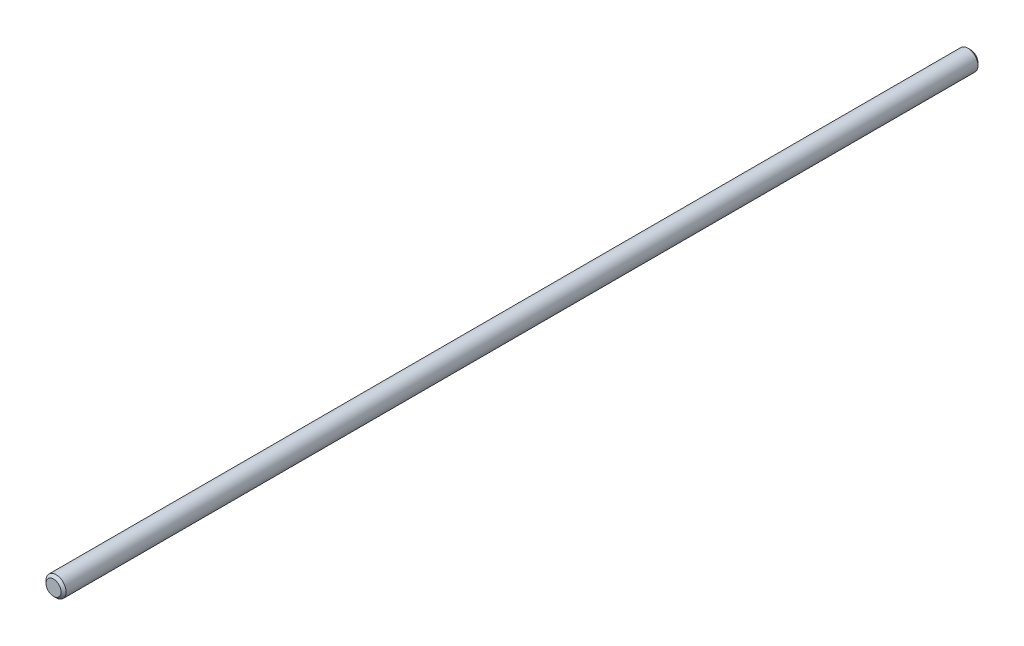
ISO-10303-21;
HEADER;
FILE_DESCRIPTION(('STEP AP214'),'2;1');
FILE_NAME('part.step','',(''),(''),'','','');
FILE_SCHEMA(('AUTOMOTIVE_DESIGN { 1 0 10303 214 1 1 1 1 }'));
ENDSEC;
DATA;
#1=APPLICATION_CONTEXT('core data for automotive mechanical design processes');
#2=APPLICATION_PROTOCOL_DEFINITION('international standard','automotive_design',2000,#1);
#3=PRODUCT_CONTEXT('',#1,'mechanical');
#4=PRODUCT('Part','Part','',(#3));
#5=PRODUCT_RELATED_PRODUCT_CATEGORY('part','',(#4));
#6=PRODUCT_DEFINITION_FORMATION('','',#4);
#7=PRODUCT_DEFINITION_CONTEXT('part definition',#1,'design');
#8=PRODUCT_DEFINITION('design','',#6,#7);
#9=PRODUCT_DEFINITION_SHAPE('','',#8);
#10=(LENGTH_UNIT() NAMED_UNIT(*) SI_UNIT(.MILLI.,.METRE.));
#11=(NAMED_UNIT(*) PLANE_ANGLE_UNIT() SI_UNIT($,.RADIAN.));
#12=(NAMED_UNIT(*) SI_UNIT($,.STERADIAN.) SOLID_ANGLE_UNIT());
#13=UNCERTAINTY_MEASURE_WITH_UNIT(LENGTH_MEASURE(1.E-05),#10,'distance_accuracy_value','');
#14=(GEOMETRIC_REPRESENTATION_CONTEXT(3) GLOBAL_UNCERTAINTY_ASSIGNED_CONTEXT((#13)) GLOBAL_UNIT_ASSIGNED_CONTEXT((#10,
#11,#12)) REPRESENTATION_CONTEXT('',''));
#15=CARTESIAN_POINT('',(0.,0.,0.));
#16=DIRECTION('',(0.,0.,1.));
#17=DIRECTION('',(1.,0.,0.));
#18=AXIS2_PLACEMENT_3D('',#15,#16,#17);
#19=CARTESIAN_POINT('',(0.,0.,365.));
#20=DIRECTION('',(0.,0.,-1.));
#21=DIRECTION('',(-1.,0.,0.));
#22=AXIS2_PLACEMENT_3D('',#19,#20,#21);
#23=CYLINDRICAL_SURFACE('',#22,4.);
#24=CARTESIAN_POINT('',(0.,0.,1.00000000000028));
#25=DIRECTION('',(0.,0.,1.));
#26=DIRECTION('',(1.,0.,0.));
#27=AXIS2_PLACEMENT_3D('',#24,#25,#26);
#28=CIRCLE('',#27,4.);
#29=CARTESIAN_POINT('',(-4.,0.,1.00000000000028));
#30=VERTEX_POINT('',#29);
#31=EDGE_CURVE('E41',#30,#30,#28,.T.);
#32=CARTESIAN_POINT('',(0.,0.,364.));
#33=DIRECTION('',(0.,0.,1.));
#34=DIRECTION('',(1.,0.,0.));
#35=AXIS2_PLACEMENT_3D('',#32,#33,#34);
#36=CIRCLE('',#35,4.);
#37=CARTESIAN_POINT('',(-4.,0.,364.));
#38=VERTEX_POINT('',#37);
#39=EDGE_CURVE('E45',#38,#38,#36,.F.);
#40=CARTESIAN_POINT('',(-4.,0.,1.00000000000028));
#41=CARTESIAN_POINT('',(-4.,0.,4.78125000000027));
#42=CARTESIAN_POINT('',(-4.,0.,8.56250000000027));
#43=CARTESIAN_POINT('',(-4.,0.,16.1250000000003));
#44=CARTESIAN_POINT('',(-4.,0.,19.9062500000003));
#45=CARTESIAN_POINT('',(-4.,0.,27.4687500000002));
#46=CARTESIAN_POINT('',(-4.,0.,31.2500000000002));
#47=CARTESIAN_POINT('',(-4.,0.,38.8125000000002));
#48=CARTESIAN_POINT('',(-4.,0.,42.5937500000003));
#49=CARTESIAN_POINT('',(-4.,0.,50.1562500000003));
#50=CARTESIAN_POINT('',(-4.,0.,53.9375000000003));
#51=CARTESIAN_POINT('',(-4.,0.,61.5000000000003));
#52=CARTESIAN_POINT('',(-4.,0.,65.2812500000003));
#53=CARTESIAN_POINT('',(-4.,0.,72.8437500000002));
#54=CARTESIAN_POINT('',(-4.,0.,76.6250000000002));
#55=CARTESIAN_POINT('',(-4.,0.,84.1875000000002));
#56=CARTESIAN_POINT('',(-4.,0.,87.9687500000003));
#57=CARTESIAN_POINT('',(-4.,0.,95.5312500000003));
#58=CARTESIAN_POINT('',(-4.,0.,99.3125000000003));
#59=CARTESIAN_POINT('',(-4.,0.,106.875));
#60=CARTESIAN_POINT('',(-4.,0.,110.65625));
#61=CARTESIAN_POINT('',(-4.,0.,118.21875));
#62=CARTESIAN_POINT('',(-4.,0.,122.));
#63=CARTESIAN_POINT('',(-4.,0.,129.5625));
#64=CARTESIAN_POINT('',(-4.,0.,133.34375));
#65=CARTESIAN_POINT('',(-4.,0.,140.90625));
#66=CARTESIAN_POINT('',(-4.,0.,144.6875));
#67=CARTESIAN_POINT('',(-4.,0.,152.25));
#68=CARTESIAN_POINT('',(-4.,0.,156.03125));
#69=CARTESIAN_POINT('',(-4.,0.,163.59375));
#70=CARTESIAN_POINT('',(-4.,0.,167.375));
#71=CARTESIAN_POINT('',(-4.,0.,174.9375));
#72=CARTESIAN_POINT('',(-4.,0.,178.71875));
#73=CARTESIAN_POINT('',(-4.,0.,186.28125));
#74=CARTESIAN_POINT('',(-4.,0.,190.0625));
#75=CARTESIAN_POINT('',(-4.,0.,197.625));
#76=CARTESIAN_POINT('',(-4.,0.,201.40625));
#77=CARTESIAN_POINT('',(-4.,0.,208.96875));
#78=CARTESIAN_POINT('',(-4.,0.,212.75));
#79=CARTESIAN_POINT('',(-4.,0.,220.3125));
#80=CARTESIAN_POINT('',(-4.,0.,224.09375));
#81=CARTESIAN_POINT('',(-4.,0.,231.65625));
#82=CARTESIAN_POINT('',(-4.,0.,235.4375));
#83=CARTESIAN_POINT('',(-4.,0.,243.));
#84=CARTESIAN_POINT('',(-4.,0.,246.78125));
#85=CARTESIAN_POINT('',(-4.,0.,254.34375));
#86=CARTESIAN_POINT('',(-4.,0.,258.125));
#87=CARTESIAN_POINT('',(-4.,0.,265.6875));
#88=CARTESIAN_POINT('',(-4.,0.,269.46875));
#89=CARTESIAN_POINT('',(-4.,0.,277.03125));
#90=CARTESIAN_POINT('',(-4.,0.,280.8125));
#91=CARTESIAN_POINT('',(-4.,0.,288.375));
#92=CARTESIAN_POINT('',(-4.,0.,292.15625));
#93=CARTESIAN_POINT('',(-4.,0.,299.71875));
#94=CARTESIAN_POINT('',(-4.,0.,303.5));
#95=CARTESIAN_POINT('',(-4.,0.,311.0625));
#96=CARTESIAN_POINT('',(-4.,0.,314.84375));
#97=CARTESIAN_POINT('',(-4.,0.,322.40625));
#98=CARTESIAN_POINT('',(-4.,0.,326.1875));
#99=CARTESIAN_POINT('',(-4.,0.,333.75));
#100=CARTESIAN_POINT('',(-4.,0.,337.53125));
#101=CARTESIAN_POINT('',(-4.,0.,345.09375));
#102=CARTESIAN_POINT('',(-4.,0.,348.875));
#103=CARTESIAN_POINT('',(-4.,0.,356.4375));
#104=CARTESIAN_POINT('',(-4.,0.,360.21875));
#105=CARTESIAN_POINT('',(-4.,0.,364.));
#106=B_SPLINE_CURVE_WITH_KNOTS('',3,(#40,#41,#42,#43,#44,#45,#46,#47,#48,#49,#50,#51,#52,#53,
#54,#55,#56,#57,#58,#59,#60,#61,#62,#63,#64,#65,#66,#67,#68,#69,#70,#71,#72,#73,#74,#75,#76,#77,
#78,#79,#80,#81,#82,#83,#84,#85,#86,#87,#88,#89,#90,#91,#92,#93,#94,#95,#96,#97,#98,#99,#100,
#101,#102,#103,#104,#105),.UNSPECIFIED.,.F.,.F.,(4,2,2,2,2,2,2,2,2,2,2,2,2,2,2,2,2,2,2,2,2,2,2,
2,2,2,2,2,2,2,2,2,4),(0.,11.34375,22.6875,34.03125,45.375,56.71875,68.0625,79.40625,90.75,
102.09375,113.4375,124.78125,136.125,147.46875,158.8125,170.15625,181.5,192.84375,204.1875,
215.53125,226.875,238.21875,249.5625,260.90625,272.25,283.59375,294.9375,306.28125,317.625,
328.96875,340.3125,351.65625,363.),.UNSPECIFIED.);
#107=EDGE_CURVE('BSEAM30',#30,#38,#106,.T.);
#108=ORIENTED_EDGE('',*,*,#31,.T.);
#109=ORIENTED_EDGE('',*,*,#39,.T.);
#110=ORIENTED_EDGE('',*,*,#107,.T.);
#111=ORIENTED_EDGE('',*,*,#107,.F.);
#112=EDGE_LOOP('',(#108,#110,#109,#111));
#113=FACE_BOUND('',#112,.T.);
#114=ADVANCED_FACE('F30',(#113),#23,.T.);
#115=CARTESIAN_POINT('',(0.,0.,365.));
#116=DIRECTION('',(0.,0.,1.));
#117=DIRECTION('',(1.,0.,0.));
#118=AXIS2_PLACEMENT_3D('',#115,#116,#117);
#119=PLANE('',#118);
#120=CARTESIAN_POINT('',(0.,0.,365.));
#121=DIRECTION('',(0.,0.,1.));
#122=DIRECTION('',(1.,0.,0.));
#123=AXIS2_PLACEMENT_3D('',#120,#121,#122);
#124=CIRCLE('',#123,3.00000000000017);
#125=CARTESIAN_POINT('',(3.00000000000017,0.,365.));
#126=VERTEX_POINT('',#125);
#127=EDGE_CURVE('E10',#126,#126,#124,.T.);
#128=ORIENTED_EDGE('',*,*,#127,.T.);
#129=EDGE_LOOP('',(#128));
#130=FACE_BOUND('',#129,.T.);
#131=ADVANCED_FACE('F61',(#130),#119,.T.);
#132=CARTESIAN_POINT('',(0.,0.,0.));
#133=DIRECTION('',(0.,0.,1.));
#134=DIRECTION('',(1.,0.,0.));
#135=AXIS2_PLACEMENT_3D('',#132,#133,#134);
#136=PLANE('',#135);
#137=CARTESIAN_POINT('',(0.,0.,0.));
#138=DIRECTION('',(0.,0.,1.));
#139=DIRECTION('',(1.,0.,0.));
#140=AXIS2_PLACEMENT_3D('',#137,#138,#139);
#141=CIRCLE('',#140,2.99999999999972);
#142=CARTESIAN_POINT('',(2.99999999999972,0.,0.));
#143=VERTEX_POINT('',#142);
#144=EDGE_CURVE('E37',#143,#143,#141,.F.);
#145=ORIENTED_EDGE('',*,*,#144,.T.);
#146=EDGE_LOOP('',(#145));
#147=FACE_BOUND('',#146,.T.);
#148=ADVANCED_FACE('F58',(#147),#136,.F.);
#149=CARTESIAN_POINT('',(0.,0.,1.00000000000028));
#150=DIRECTION('',(0.,0.,1.));
#151=DIRECTION('',(1.,0.,0.));
#152=AXIS2_PLACEMENT_3D('',#149,#150,#151);
#153=CONICAL_SURFACE('',#152,4.,0.785398163397447);
#154=ORIENTED_EDGE('',*,*,#144,.F.);
#155=EDGE_LOOP('',(#154));
#156=FACE_BOUND('',#155,.T.);
#157=ORIENTED_EDGE('',*,*,#31,.F.);
#158=EDGE_LOOP('',(#157));
#159=FACE_BOUND('',#158,.T.);
#160=ADVANCED_FACE('F54',(#156,#159),#153,.T.);
#161=CARTESIAN_POINT('',(0.,0.,365.));
#162=DIRECTION('',(0.,0.,-1.));
#163=DIRECTION('',(-1.,0.,0.));
#164=AXIS2_PLACEMENT_3D('',#161,#162,#163);
#165=CONICAL_SURFACE('',#164,3.00000000000017,0.785398163397447);
#166=ORIENTED_EDGE('',*,*,#39,.F.);
#167=EDGE_LOOP('',(#166));
#168=FACE_BOUND('',#167,.T.);
#169=ORIENTED_EDGE('',*,*,#127,.F.);
#170=EDGE_LOOP('',(#169));
#171=FACE_BOUND('',#170,.T.);
#172=ADVANCED_FACE('F32',(#168,#171),#165,.T.);
#173=CLOSED_SHELL('',(#114,#131,#148,#160,#172));
#174=MANIFOLD_SOLID_BREP('B2',#173);
#175=ADVANCED_BREP_SHAPE_REPRESENTATION('',(#18,#174),#14);
#176=SHAPE_DEFINITION_REPRESENTATION(#9,#175);
ENDSEC;
END-ISO-10303-21;
